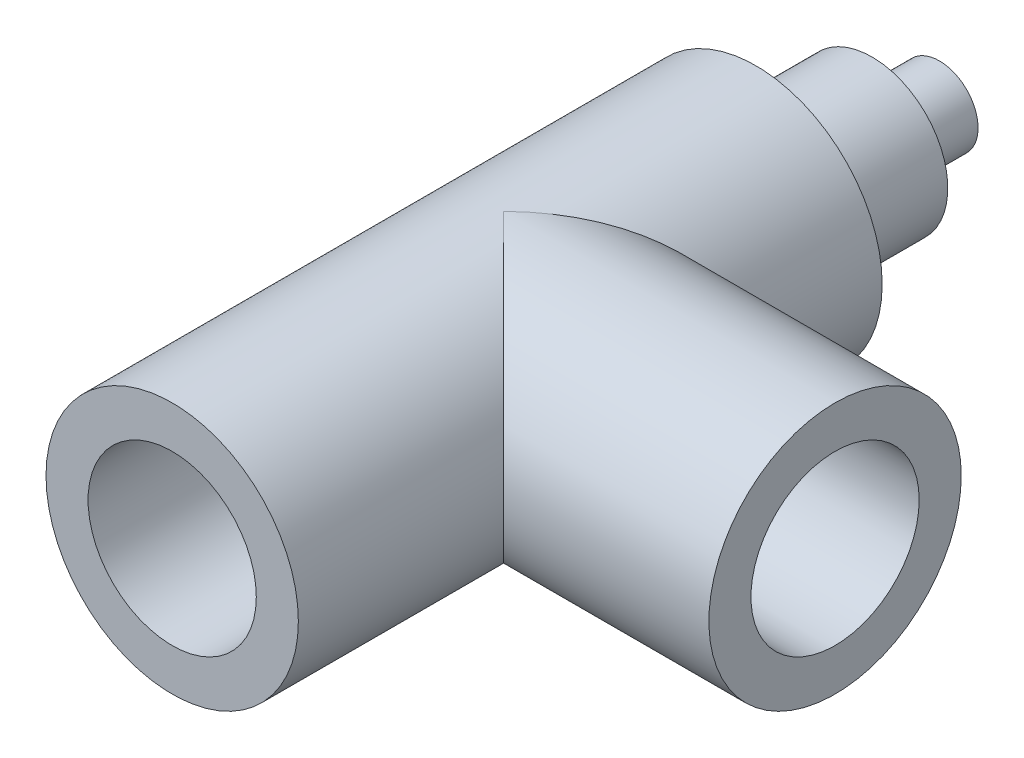
ISO-10303-21;
HEADER;
FILE_DESCRIPTION(('STEP AP214'),'2;1');
FILE_NAME('part.step','',(''),(''),'','','');
FILE_SCHEMA(('AUTOMOTIVE_DESIGN { 1 0 10303 214 1 1 1 1 }'));
ENDSEC;
DATA;
#1=APPLICATION_CONTEXT('core data for automotive mechanical design processes');
#2=APPLICATION_PROTOCOL_DEFINITION('international standard','automotive_design',2000,#1);
#3=PRODUCT_CONTEXT('',#1,'mechanical');
#4=PRODUCT('Part','Part','',(#3));
#5=PRODUCT_RELATED_PRODUCT_CATEGORY('part','',(#4));
#6=PRODUCT_DEFINITION_FORMATION('','',#4);
#7=PRODUCT_DEFINITION_CONTEXT('part definition',#1,'design');
#8=PRODUCT_DEFINITION('design','',#6,#7);
#9=PRODUCT_DEFINITION_SHAPE('','',#8);
#10=(LENGTH_UNIT() NAMED_UNIT(*) SI_UNIT(.MILLI.,.METRE.));
#11=(NAMED_UNIT(*) PLANE_ANGLE_UNIT() SI_UNIT($,.RADIAN.));
#12=(NAMED_UNIT(*) SI_UNIT($,.STERADIAN.) SOLID_ANGLE_UNIT());
#13=UNCERTAINTY_MEASURE_WITH_UNIT(LENGTH_MEASURE(1.E-05),#10,'distance_accuracy_value','');
#14=(GEOMETRIC_REPRESENTATION_CONTEXT(3) GLOBAL_UNCERTAINTY_ASSIGNED_CONTEXT((#13)) GLOBAL_UNIT_ASSIGNED_CONTEXT((#10,
#11,#12)) REPRESENTATION_CONTEXT('',''));
#15=CARTESIAN_POINT('',(0.,0.,0.));
#16=DIRECTION('',(0.,0.,1.));
#17=DIRECTION('',(1.,0.,0.));
#18=AXIS2_PLACEMENT_3D('',#15,#16,#17);
#19=CARTESIAN_POINT('',(0.,0.,-55.626));
#20=DIRECTION('',(0.,0.,-1.));
#21=DIRECTION('',(-1.,0.,0.));
#22=AXIS2_PLACEMENT_3D('',#19,#20,#21);
#23=PLANE('',#22);
#24=CARTESIAN_POINT('',(0.,0.,-55.626));
#25=DIRECTION('',(0.,0.,-1.));
#26=DIRECTION('',(-1.,0.,0.));
#27=AXIS2_PLACEMENT_3D('',#24,#25,#26);
#28=CIRCLE('',#27,11.43);
#29=CARTESIAN_POINT('',(-11.43,0.,-55.626));
#30=VERTEX_POINT('',#29);
#31=EDGE_CURVE('E176',#30,#30,#28,.T.);
#32=ORIENTED_EDGE('',*,*,#31,.T.);
#33=EDGE_LOOP('',(#32));
#34=FACE_BOUND('',#33,.T.);
#35=CARTESIAN_POINT('',(0.,0.,-55.626));
#36=DIRECTION('',(0.,0.,-1.));
#37=DIRECTION('',(-1.,0.,0.));
#38=AXIS2_PLACEMENT_3D('',#35,#36,#37);
#39=CIRCLE('',#38,5.842);
#40=CARTESIAN_POINT('',(-5.842,0.,-55.626));
#41=VERTEX_POINT('',#40);
#42=EDGE_CURVE('E161',#41,#41,#39,.T.);
#43=ORIENTED_EDGE('',*,*,#42,.F.);
#44=EDGE_LOOP('',(#43));
#45=FACE_BOUND('',#44,.T.);
#46=ADVANCED_FACE('F32',(#34,#45),#23,.T.);
#47=CARTESIAN_POINT('',(0.,0.,-38.1));
#48=DIRECTION('',(0.,0.,-1.));
#49=DIRECTION('',(-1.,0.,0.));
#50=AXIS2_PLACEMENT_3D('',#47,#48,#49);
#51=PLANE('',#50);
#52=CARTESIAN_POINT('',(0.,0.,-38.1));
#53=DIRECTION('',(0.,0.,-1.));
#54=DIRECTION('',(-1.,0.,0.));
#55=AXIS2_PLACEMENT_3D('',#52,#53,#54);
#56=CIRCLE('',#55,19.05);
#57=CARTESIAN_POINT('',(-19.05,0.,-38.1));
#58=VERTEX_POINT('',#57);
#59=EDGE_CURVE('E182',#58,#58,#56,.T.);
#60=ORIENTED_EDGE('',*,*,#59,.T.);
#61=EDGE_LOOP('',(#60));
#62=FACE_BOUND('',#61,.T.);
#63=CARTESIAN_POINT('',(0.,0.,-38.1));
#64=DIRECTION('',(0.,0.,-1.));
#65=DIRECTION('',(-1.,0.,0.));
#66=AXIS2_PLACEMENT_3D('',#63,#64,#65);
#67=CIRCLE('',#66,11.43);
#68=CARTESIAN_POINT('',(-11.43,0.,-38.1));
#69=VERTEX_POINT('',#68);
#70=EDGE_CURVE('E173',#69,#69,#67,.T.);
#71=ORIENTED_EDGE('',*,*,#70,.F.);
#72=EDGE_LOOP('',(#71));
#73=FACE_BOUND('',#72,.T.);
#74=ADVANCED_FACE('F288',(#62,#73),#51,.T.);
#75=CARTESIAN_POINT('',(0.,0.,-19.05));
#76=DIRECTION('',(0.,0.,1.));
#77=DIRECTION('',(1.,0.,0.));
#78=AXIS2_PLACEMENT_3D('',#75,#76,#77);
#79=CYLINDRICAL_SURFACE('',#78,12.7);
#80=CARTESIAN_POINT('',(0.,0.,50.038));
#81=DIRECTION('',(0.,0.,1.));
#82=DIRECTION('',(1.,0.,0.));
#83=AXIS2_PLACEMENT_3D('',#80,#81,#82);
#84=CIRCLE('',#83,12.7);
#85=CARTESIAN_POINT('',(12.7,0.,50.038));
#86=VERTEX_POINT('',#85);
#87=EDGE_CURVE('E191',#86,#86,#84,.T.);
#88=ORIENTED_EDGE('',*,*,#87,.T.);
#89=EDGE_LOOP('',(#88));
#90=FACE_BOUND('',#89,.T.);
#91=CARTESIAN_POINT('',(0.254000000000004,0.,0.));
#92=DIRECTION('',(-1.,0.,0.));
#93=DIRECTION('',(0.,-1.,0.));
#94=AXIS2_PLACEMENT_3D('',#91,#92,#93);
#95=CIRCLE('',#94,12.7);
#96=CARTESIAN_POINT('',(0.254000000000004,-12.6993649364873,0.));
#97=VERTEX_POINT('',#96);
#98=CARTESIAN_POINT('',(0.254000000000004,-12.6974597459492,0.254000000000006));
#99=VERTEX_POINT('',#98);
#100=EDGE_CURVE('E238',#97,#99,#95,.T.);
#101=ORIENTED_EDGE('',*,*,#100,.F.);
#102=CARTESIAN_POINT('',(0.,0.,0.));
#103=DIRECTION('',(0.,0.,1.));
#104=DIRECTION('',(1.,0.,0.));
#105=AXIS2_PLACEMENT_3D('',#102,#103,#104);
#106=CIRCLE('',#105,12.7);
#107=CARTESIAN_POINT('',(0.254000000000004,12.6993649364873,0.));
#108=VERTEX_POINT('',#107);
#109=EDGE_CURVE('E229',#108,#97,#106,.T.);
#110=ORIENTED_EDGE('',*,*,#109,.F.);
#111=CARTESIAN_POINT('',(0.254000000000004,0.,0.));
#112=DIRECTION('',(-1.,0.,0.));
#113=DIRECTION('',(0.,0.999799979995999,0.0200000000000005));
#114=AXIS2_PLACEMENT_3D('',#111,#112,#113);
#115=CIRCLE('',#114,12.7);
#116=CARTESIAN_POINT('',(0.254000000000004,12.6974597459492,0.254000000000006));
#117=VERTEX_POINT('',#116);
#118=EDGE_CURVE('E247',#117,#108,#115,.T.);
#119=ORIENTED_EDGE('',*,*,#118,.F.);
#120=CARTESIAN_POINT('',(0.,0.,0.));
#121=DIRECTION('',(-0.707106781186547,0.,0.707106781186547));
#122=DIRECTION('',(0.707106781186547,0.,0.707106781186547));
#123=AXIS2_PLACEMENT_3D('',#120,#121,#122);
#124=ELLIPSE('',#123,17.9605122421383,12.7);
#125=EDGE_CURVE('E244',#117,#99,#124,.F.);
#126=ORIENTED_EDGE('',*,*,#125,.T.);
#127=EDGE_LOOP('',(#101,#110,#119,#126));
#128=FACE_BOUND('',#127,.T.);
#129=ADVANCED_FACE('F213',(#90,#128),#79,.F.);
#130=CARTESIAN_POINT('',(50.038,0.,0.));
#131=DIRECTION('',(-1.,0.,0.));
#132=DIRECTION('',(0.,0.,1.));
#133=AXIS2_PLACEMENT_3D('',#130,#131,#132);
#134=CYLINDRICAL_SURFACE('',#133,19.05);
#135=CARTESIAN_POINT('',(50.038,0.,0.));
#136=DIRECTION('',(1.,0.,0.));
#137=DIRECTION('',(0.,0.,-1.));
#138=AXIS2_PLACEMENT_3D('',#135,#136,#137);
#139=CIRCLE('',#138,19.05);
#140=CARTESIAN_POINT('',(50.038,0.,-19.05));
#141=VERTEX_POINT('',#140);
#142=EDGE_CURVE('E230',#141,#141,#139,.T.);
#143=ORIENTED_EDGE('',*,*,#142,.F.);
#144=EDGE_LOOP('',(#143));
#145=FACE_BOUND('',#144,.T.);
#146=CARTESIAN_POINT('',(0.,0.,0.));
#147=DIRECTION('',(-0.707106781186548,0.,-0.707106781186547));
#148=DIRECTION('',(-0.707106781186548,0.,0.707106781186547));
#149=AXIS2_PLACEMENT_3D('',#146,#147,#148);
#150=ELLIPSE('',#149,26.9407683632075,19.05);
#151=CARTESIAN_POINT('',(0.,19.05,0.));
#152=VERTEX_POINT('',#151);
#153=CARTESIAN_POINT('',(0.,-19.05,0.));
#154=VERTEX_POINT('',#153);
#155=EDGE_CURVE('E185',#152,#154,#150,.T.);
#156=ORIENTED_EDGE('',*,*,#155,.F.);
#157=CARTESIAN_POINT('',(0.,0.,0.));
#158=DIRECTION('',(0.707106781186547,0.,-0.707106781186547));
#159=DIRECTION('',(-0.707106781186547,0.,-0.707106781186547));
#160=AXIS2_PLACEMENT_3D('',#157,#158,#159);
#161=ELLIPSE('',#160,26.9407683632075,19.05);
#162=EDGE_CURVE('E233',#152,#154,#161,.T.);
#163=ORIENTED_EDGE('',*,*,#162,.T.);
#164=EDGE_LOOP('',(#156,#163));
#165=FACE_BOUND('',#164,.T.);
#166=ADVANCED_FACE('F208',(#145,#165),#134,.T.);
#167=CARTESIAN_POINT('',(0.254000000000004,0.,0.));
#168=DIRECTION('',(1.,0.,0.));
#169=DIRECTION('',(0.,0.,-1.));
#170=AXIS2_PLACEMENT_3D('',#167,#168,#169);
#171=CYLINDRICAL_SURFACE('',#170,12.7);
#172=CARTESIAN_POINT('',(50.038,0.,0.));
#173=DIRECTION('',(1.,0.,0.));
#174=DIRECTION('',(0.,0.,-1.));
#175=AXIS2_PLACEMENT_3D('',#172,#173,#174);
#176=CIRCLE('',#175,12.7);
#177=CARTESIAN_POINT('',(50.038,0.,-12.7));
#178=VERTEX_POINT('',#177);
#179=EDGE_CURVE('E188',#178,#178,#176,.T.);
#180=ORIENTED_EDGE('',*,*,#179,.T.);
#181=EDGE_LOOP('',(#180));
#182=FACE_BOUND('',#181,.T.);
#183=DIRECTION('',(1.,0.,0.));
#184=VECTOR('',#183,1.);
#185=CARTESIAN_POINT('',(0.254000000000004,12.7,0.));
#186=LINE('',#185,#184);
#187=CARTESIAN_POINT('',(14.1990316571237,12.7,0.));
#188=VERTEX_POINT('',#187);
#189=EDGE_CURVE('E11',#188,#108,#186,.F.);
#190=ORIENTED_EDGE('',*,*,#189,.F.);
#191=CARTESIAN_POINT('',(14.1990316571237,-12.7,0.));
#192=CARTESIAN_POINT('',(14.1990243432653,-12.7000024971556,-0.156093266572542));
#193=CARTESIAN_POINT('',(14.201606918338,-12.6971214138173,-0.31216020868409));
#194=CARTESIAN_POINT('',(14.2118794412357,-12.6856245548947,-0.6238991319489));
#195=CARTESIAN_POINT('',(14.2195688784517,-12.6770093526354,-0.779571151026618));
#196=CARTESIAN_POINT('',(14.2501571767728,-12.6426469086637,-1.24503366753484));
#197=CARTESIAN_POINT('',(14.2805764862088,-12.6083826038732,-1.55376975804739));
#198=CARTESIAN_POINT('',(14.3596099397477,-12.518290929081,-2.16244940776499));
#199=CARTESIAN_POINT('',(14.4080415785084,-12.4626796759057,-2.46244966724968));
#200=CARTESIAN_POINT('',(14.5210191651402,-12.3308566689351,-3.05484636699331));
#201=CARTESIAN_POINT('',(14.5855697997495,-12.2546389230888,-3.34724056837474));
#202=CARTESIAN_POINT('',(14.7279316270802,-12.0831636655958,-3.92127836908744));
#203=CARTESIAN_POINT('',(14.8056715689297,-11.9880080053162,-4.20297026934815));
#204=CARTESIAN_POINT('',(14.972082302066,-11.7795197251442,-4.75608244719976));
#205=CARTESIAN_POINT('',(15.0607525372394,-11.666188029927,-5.02750324644802));
#206=CARTESIAN_POINT('',(15.3399737044406,-11.2996386846549,-5.8268559808617));
#207=CARTESIAN_POINT('',(15.5434085589588,-11.0202425000402,-6.33864041249572));
#208=CARTESIAN_POINT('',(15.876716418503,-10.5299449634905,-7.1078786639665));
#209=CARTESIAN_POINT('',(16.0013648364851,-10.3399615955413,-7.38144842274911));
#210=CARTESIAN_POINT('',(16.2530541823922,-9.93964524846194,-7.91226094555107));
#211=CARTESIAN_POINT('',(16.3800952687005,-9.72931091835389,-8.16950262376774));
#212=CARTESIAN_POINT('',(16.6337682589346,-9.28896489747604,-8.66692173021837));
#213=CARTESIAN_POINT('',(16.7604000039186,-9.05894633891537,-8.90709314873057));
#214=CARTESIAN_POINT('',(17.010613537037,-8.57989275039606,-9.36943156414286));
#215=CARTESIAN_POINT('',(17.1341951155552,-8.33085641826974,-9.59159732602529));
#216=CARTESIAN_POINT('',(17.3933377695029,-7.77694210083509,-10.0476790278662));
#217=CARTESIAN_POINT('',(17.5280374112121,-7.46920317322735,-10.2786273594757));
#218=CARTESIAN_POINT('',(17.786547874557,-6.83079913776941,-10.7135124529004));
#219=CARTESIAN_POINT('',(17.9103573763927,-6.50013125976983,-10.9174459422388));
#220=CARTESIAN_POINT('',(18.1434799149075,-5.8177750849115,-11.2958199913717));
#221=CARTESIAN_POINT('',(18.2528036870842,-5.46610263833013,-11.470282419079));
#222=CARTESIAN_POINT('',(18.4536988288141,-4.74382748353269,-11.787347016129));
#223=CARTESIAN_POINT('',(18.5452740025189,-4.37322885342981,-11.9299560137881));
#224=CARTESIAN_POINT('',(18.6985277332833,-3.65865182713615,-12.1667426687136));
#225=CARTESIAN_POINT('',(18.7624075239545,-3.31634998261398,-12.2645584401567));
#226=CARTESIAN_POINT('',(18.8719725718933,-2.62195236820408,-12.4315255651508));
#227=CARTESIAN_POINT('',(18.9176590569611,-2.26985726094436,-12.5006788530414));
#228=CARTESIAN_POINT('',(18.9894135710427,-1.55948274873719,-12.609003646454));
#229=CARTESIAN_POINT('',(19.015502274967,-1.20121027015352,-12.6482067490222));
#230=CARTESIAN_POINT('',(19.0473097392374,-0.481745935319567,-12.6959771681131));
#231=CARTESIAN_POINT('',(19.053031373673,-0.120554498187186,-12.7045488071809));
#232=CARTESIAN_POINT('',(19.0446325973002,0.545977117299571,-12.6919472067397));
#233=CARTESIAN_POINT('',(19.0334006929989,0.851447662486878,-12.6751042081578));
#234=CARTESIAN_POINT('',(18.996451065379,1.45947752977953,-12.6195518433243));
#235=CARTESIAN_POINT('',(18.9707352118784,1.76203722253707,-12.5808452995642));
#236=CARTESIAN_POINT('',(18.9053955177865,2.36212584065394,-12.4821010364081));
#237=CARTESIAN_POINT('',(18.8657710777771,2.65965454861369,-12.4220623976618));
#238=CARTESIAN_POINT('',(18.7734723737981,3.24774355834998,-12.281432245944));
#239=CARTESIAN_POINT('',(18.7207975458954,3.5383035583996,-12.2008398447993));
#240=CARTESIAN_POINT('',(18.6037334547357,4.10953188898308,-12.0204444837326));
#241=CARTESIAN_POINT('',(18.5393953016367,4.39023723780633,-11.9207252335232));
#242=CARTESIAN_POINT('',(18.4000604807808,4.94178325730278,-11.7028518347583));
#243=CARTESIAN_POINT('',(18.3250595346928,5.2126199132017,-11.5846902845573));
#244=CARTESIAN_POINT('',(18.165778900459,5.74314159926364,-11.3310529872876));
#245=CARTESIAN_POINT('',(18.0815009233468,6.00282867358842,-11.1955804322807));
#246=CARTESIAN_POINT('',(17.9050658018781,6.51024510289678,-10.9083329015306));
#247=CARTESIAN_POINT('',(17.8129077329909,6.7579730494282,-10.7565560123469));
#248=CARTESIAN_POINT('',(17.6096449511395,7.27249098316756,-10.4167177969197));
#249=CARTESIAN_POINT('',(17.4976417756893,7.53750908166859,-10.2265092208582));
#250=CARTESIAN_POINT('',(17.2676036675679,8.05055395621718,-9.82772451495387));
#251=CARTESIAN_POINT('',(17.1495682838252,8.29857945835083,-9.61914701068829));
#252=CARTESIAN_POINT('',(16.9095403385389,8.77734277512638,-9.18438670209434));
#253=CARTESIAN_POINT('',(16.7875424620975,9.00805587014066,-8.95817963006628));
#254=CARTESIAN_POINT('',(16.542086885425,9.45124551313284,-8.48928988397978));
#255=CARTESIAN_POINT('',(16.4186291037771,9.66372103851809,-8.24660628743628));
#256=CARTESIAN_POINT('',(16.1536272890879,10.1013861533791,-7.70654535577173));
#257=CARTESIAN_POINT('',(16.0122506737175,10.3234292928946,-7.40652576668948));
#258=CARTESIAN_POINT('',(15.7349583258097,10.7413451130242,-6.78626392513487));
#259=CARTESIAN_POINT('',(15.5990438755224,10.9372116734597,-6.46601696911488));
#260=CARTESIAN_POINT('',(15.3374386168,11.3011347365438,-5.80655199947935));
#261=CARTESIAN_POINT('',(15.2117374715267,11.4692195398227,-5.46735376844747));
#262=CARTESIAN_POINT('',(14.9755413827591,11.7759562037639,-4.77089826910036));
#263=CARTESIAN_POINT('',(14.8650387810908,11.9146229067357,-4.4136502206479));
#264=CARTESIAN_POINT('',(14.6927288221658,12.1259747283617,-3.78520870515959));
#265=CARTESIAN_POINT('',(14.6259488985521,12.2062643730825,-3.51791694068507));
#266=CARTESIAN_POINT('',(14.5051397309684,12.3495837139939,-2.97595130211546));
#267=CARTESIAN_POINT('',(14.451106823193,12.4126183705292,-2.70127957454793));
#268=CARTESIAN_POINT('',(14.3577951581124,12.5204353252326,-2.14669257331755));
#269=CARTESIAN_POINT('',(14.318476680619,12.56526678941,-1.86679358894581));
#270=CARTESIAN_POINT('',(14.2559401744115,12.6361756583378,-1.30295382405626));
#271=CARTESIAN_POINT('',(14.232712084845,12.6622647825084,-1.01901568267144));
#272=CARTESIAN_POINT('',(14.2116900493631,12.6858359044081,-0.612018807964135));
#273=CARTESIAN_POINT('',(14.2069467159929,12.6911462309692,-0.489703070018413));
#274=CARTESIAN_POINT('',(14.200617175157,12.6982278017591,-0.244930329655405));
#275=CARTESIAN_POINT('',(14.1990298699521,12.7000002765348,-0.122473391184785));
#276=CARTESIAN_POINT('',(14.1990316571237,12.7,0.));
#277=B_SPLINE_CURVE_WITH_KNOTS('',3,(#191,#192,#193,#194,#195,#196,#197,#198,#199,#200,#201,
#202,#203,#204,#205,#206,#207,#208,#209,#210,#211,#212,#213,#214,#215,#216,#217,#218,#219,#220,
#221,#222,#223,#224,#225,#226,#227,#228,#229,#230,#231,#232,#233,#234,#235,#236,#237,#238,#239,
#240,#241,#242,#243,#244,#245,#246,#247,#248,#249,#250,#251,#252,#253,#254,#255,#256,#257,#258,
#259,#260,#261,#262,#263,#264,#265,#266,#267,#268,#269,#270,#271,#272,#273,#274,#275,#276),
.UNSPECIFIED.,.F.,.F.,(4,2,2,2,2,2,2,2,2,2,2,2,2,2,2,2,2,2,2,2,2,2,2,2,2,2,2,2,2,2,2,2,2,2,2,2,
2,2,2,2,2,2,4),(0.,0.468180486109431,0.936314168289548,1.8710906779756,2.79664298417309,
3.72246471673835,4.64343559899405,5.56435964325145,7.41017281163777,8.47631623496532,
9.54253048175635,10.6091182573324,11.6757791289306,12.8971128940589,14.1185944719546,
15.3391656749505,16.5594749764105,17.6429101512111,18.7262721965139,19.8084897249474,
20.8905545307109,21.8078640316787,22.7250551389121,23.6422857791634,24.5595560616801,
25.472899865183,26.3866111778084,27.3001542491562,28.2138046492603,29.2474964082746,
30.2812655772728,31.3164837899865,32.351760010207,33.547745441447,34.744010011026,
35.9390483612628,37.1334823375122,37.9935928262201,38.8534557960235,39.7109806131073,
40.5679687596592,40.9354611344643,41.3028256646068),.UNSPECIFIED.);
#278=CARTESIAN_POINT('',(14.1990316571237,-12.7,0.));
#279=VERTEX_POINT('',#278);
#280=EDGE_CURVE('E41',#279,#188,#277,.T.);
#281=ORIENTED_EDGE('',*,*,#280,.F.);
#282=DIRECTION('',(1.,0.,0.));
#283=VECTOR('',#282,1.);
#284=CARTESIAN_POINT('',(0.254000000000004,-12.7,0.));
#285=LINE('',#284,#283);
#286=EDGE_CURVE('E262',#97,#279,#285,.T.);
#287=ORIENTED_EDGE('',*,*,#286,.F.);
#288=ORIENTED_EDGE('',*,*,#100,.T.);
#289=ORIENTED_EDGE('',*,*,#125,.F.);
#290=ORIENTED_EDGE('',*,*,#118,.T.);
#291=EDGE_LOOP('',(#190,#281,#287,#288,#289,#290));
#292=FACE_BOUND('',#291,.T.);
#293=ADVANCED_FACE('F198',(#182,#292),#171,.F.);
#294=CARTESIAN_POINT('',(0.,0.,50.038));
#295=DIRECTION('',(0.,0.,-1.));
#296=DIRECTION('',(-1.,0.,0.));
#297=AXIS2_PLACEMENT_3D('',#294,#295,#296);
#298=CYLINDRICAL_SURFACE('',#297,19.05);
#299=CARTESIAN_POINT('',(0.,0.,50.038));
#300=DIRECTION('',(0.,0.,1.));
#301=DIRECTION('',(1.,0.,0.));
#302=AXIS2_PLACEMENT_3D('',#299,#300,#301);
#303=CIRCLE('',#302,19.05);
#304=CARTESIAN_POINT('',(19.05,0.,50.038));
#305=VERTEX_POINT('',#304);
#306=EDGE_CURVE('E235',#305,#305,#303,.T.);
#307=ORIENTED_EDGE('',*,*,#306,.F.);
#308=EDGE_LOOP('',(#307));
#309=FACE_BOUND('',#308,.T.);
#310=ORIENTED_EDGE('',*,*,#162,.F.);
#311=ORIENTED_EDGE('',*,*,#155,.T.);
#312=EDGE_LOOP('',(#310,#311));
#313=FACE_BOUND('',#312,.T.);
#314=ORIENTED_EDGE('',*,*,#59,.F.);
#315=EDGE_LOOP('',(#314));
#316=FACE_BOUND('',#315,.T.);
#317=ADVANCED_FACE('F34',(#309,#313,#316),#298,.T.);
#318=CARTESIAN_POINT('',(0.,0.,50.038));
#319=DIRECTION('',(0.,0.,1.));
#320=DIRECTION('',(1.,0.,0.));
#321=AXIS2_PLACEMENT_3D('',#318,#319,#320);
#322=PLANE('',#321);
#323=ORIENTED_EDGE('',*,*,#87,.F.);
#324=EDGE_LOOP('',(#323));
#325=FACE_BOUND('',#324,.T.);
#326=ORIENTED_EDGE('',*,*,#306,.T.);
#327=EDGE_LOOP('',(#326));
#328=FACE_BOUND('',#327,.T.);
#329=ADVANCED_FACE('F416',(#325,#328),#322,.T.);
#330=CARTESIAN_POINT('',(50.038,0.,0.));
#331=DIRECTION('',(1.,0.,0.));
#332=DIRECTION('',(0.,0.,-1.));
#333=AXIS2_PLACEMENT_3D('',#330,#331,#332);
#334=PLANE('',#333);
#335=ORIENTED_EDGE('',*,*,#179,.F.);
#336=EDGE_LOOP('',(#335));
#337=FACE_BOUND('',#336,.T.);
#338=ORIENTED_EDGE('',*,*,#142,.T.);
#339=EDGE_LOOP('',(#338));
#340=FACE_BOUND('',#339,.T.);
#341=ADVANCED_FACE('F285',(#337,#340),#334,.T.);
#342=CARTESIAN_POINT('',(0.,0.,0.));
#343=DIRECTION('',(0.,0.,-1.));
#344=DIRECTION('',(-1.,0.,0.));
#345=AXIS2_PLACEMENT_3D('',#342,#343,#344);
#346=PLANE('',#345);
#347=ORIENTED_EDGE('',*,*,#189,.T.);
#348=ORIENTED_EDGE('',*,*,#109,.T.);
#349=ORIENTED_EDGE('',*,*,#286,.T.);
#350=CARTESIAN_POINT('',(0.,0.,0.));
#351=DIRECTION('',(0.,0.,-1.));
#352=DIRECTION('',(-1.,0.,0.));
#353=AXIS2_PLACEMENT_3D('',#350,#351,#352);
#354=CIRCLE('',#353,19.05);
#355=EDGE_CURVE('E179',#188,#279,#354,.T.);
#356=ORIENTED_EDGE('',*,*,#355,.F.);
#357=EDGE_LOOP('',(#347,#348,#349,#356));
#358=FACE_BOUND('',#357,.T.);
#359=ADVANCED_FACE('F273',(#358),#346,.F.);
#360=CARTESIAN_POINT('',(0.,0.,-38.1));
#361=DIRECTION('',(0.,0.,1.));
#362=DIRECTION('',(1.,0.,0.));
#363=AXIS2_PLACEMENT_3D('',#360,#361,#362);
#364=CYLINDRICAL_SURFACE('',#363,19.05);
#365=ORIENTED_EDGE('',*,*,#355,.T.);
#366=ORIENTED_EDGE('',*,*,#280,.T.);
#367=EDGE_LOOP('',(#365,#366));
#368=FACE_BOUND('',#367,.T.);
#369=ADVANCED_FACE('F210',(#368),#364,.T.);
#370=CARTESIAN_POINT('',(0.,0.,-55.626));
#371=DIRECTION('',(0.,0.,1.));
#372=DIRECTION('',(1.,0.,0.));
#373=AXIS2_PLACEMENT_3D('',#370,#371,#372);
#374=CYLINDRICAL_SURFACE('',#373,11.43);
#375=ORIENTED_EDGE('',*,*,#31,.F.);
#376=EDGE_LOOP('',(#375));
#377=FACE_BOUND('',#376,.T.);
#378=ORIENTED_EDGE('',*,*,#70,.T.);
#379=EDGE_LOOP('',(#378));
#380=FACE_BOUND('',#379,.T.);
#381=ADVANCED_FACE('F277',(#377,#380),#374,.T.);
#382=CARTESIAN_POINT('',(0.,0.,-65.786));
#383=DIRECTION('',(0.,0.,1.));
#384=DIRECTION('',(1.,0.,0.));
#385=AXIS2_PLACEMENT_3D('',#382,#383,#384);
#386=CYLINDRICAL_SURFACE('',#385,5.842);
#387=CARTESIAN_POINT('',(0.,0.,-65.786));
#388=DIRECTION('',(0.,0.,-1.));
#389=DIRECTION('',(-1.,0.,0.));
#390=AXIS2_PLACEMENT_3D('',#387,#388,#389);
#391=CIRCLE('',#390,5.842);
#392=CARTESIAN_POINT('',(-5.842,0.,-65.786));
#393=VERTEX_POINT('',#392);
#394=EDGE_CURVE('E170',#393,#393,#391,.T.);
#395=ORIENTED_EDGE('',*,*,#394,.F.);
#396=EDGE_LOOP('',(#395));
#397=FACE_BOUND('',#396,.T.);
#398=ORIENTED_EDGE('',*,*,#42,.T.);
#399=EDGE_LOOP('',(#398));
#400=FACE_BOUND('',#399,.T.);
#401=ADVANCED_FACE('F282',(#397,#400),#386,.T.);
#402=CARTESIAN_POINT('',(0.,0.,-65.786));
#403=DIRECTION('',(0.,0.,-1.));
#404=DIRECTION('',(-1.,0.,0.));
#405=AXIS2_PLACEMENT_3D('',#402,#403,#404);
#406=PLANE('',#405);
#407=DIRECTION('',(-0.499999999999995,0.866025403784442,0.));
#408=VECTOR('',#407,1.);
#409=CARTESIAN_POINT('',(-2.22788205628767,-3.85880491476116,-65.786));
#410=LINE('',#409,#408);
#411=CARTESIAN_POINT('',(-2.22788205628767,-3.85880491476116,-65.786));
#412=VERTEX_POINT('',#411);
#413=CARTESIAN_POINT('',(-4.45576411257524,0.,-65.786));
#414=VERTEX_POINT('',#413);
#415=EDGE_CURVE('E49',#412,#414,#410,.T.);
#416=ORIENTED_EDGE('',*,*,#415,.F.);
#417=DIRECTION('',(-1.,0.,0.));
#418=VECTOR('',#417,1.);
#419=CARTESIAN_POINT('',(2.22788205628758,-3.85880491476121,-65.786));
#420=LINE('',#419,#418);
#421=CARTESIAN_POINT('',(2.22788205628758,-3.85880491476121,-65.786));
#422=VERTEX_POINT('',#421);
#423=EDGE_CURVE('E141',#422,#412,#420,.T.);
#424=ORIENTED_EDGE('',*,*,#423,.F.);
#425=DIRECTION('',(-0.500000000000007,-0.866025403784435,0.));
#426=VECTOR('',#425,1.);
#427=CARTESIAN_POINT('',(4.45576411257524,0.,-65.786));
#428=LINE('',#427,#426);
#429=CARTESIAN_POINT('',(4.45576411257524,0.,-65.786));
#430=VERTEX_POINT('',#429);
#431=EDGE_CURVE('E135',#430,#422,#428,.T.);
#432=ORIENTED_EDGE('',*,*,#431,.F.);
#433=DIRECTION('',(0.499999999999995,-0.866025403784441,0.));
#434=VECTOR('',#433,1.);
#435=CARTESIAN_POINT('',(2.22788205628764,3.85880491476117,-65.786));
#436=LINE('',#435,#434);
#437=CARTESIAN_POINT('',(2.22788205628764,3.85880491476117,-65.786));
#438=VERTEX_POINT('',#437);
#439=EDGE_CURVE('E133',#438,#430,#436,.T.);
#440=ORIENTED_EDGE('',*,*,#439,.F.);
#441=DIRECTION('',(1.,0.,0.));
#442=VECTOR('',#441,1.);
#443=CARTESIAN_POINT('',(-2.22788205628761,3.85880491476119,-65.786));
#444=LINE('',#443,#442);
#445=CARTESIAN_POINT('',(-2.22788205628761,3.85880491476119,-65.786));
#446=VERTEX_POINT('',#445);
#447=EDGE_CURVE('E114',#446,#438,#444,.T.);
#448=ORIENTED_EDGE('',*,*,#447,.F.);
#449=DIRECTION('',(0.500000000000001,0.866025403784438,0.));
#450=VECTOR('',#449,1.);
#451=CARTESIAN_POINT('',(-4.45576411257524,0.,-65.786));
#452=LINE('',#451,#450);
#453=EDGE_CURVE('E125',#414,#446,#452,.T.);
#454=ORIENTED_EDGE('',*,*,#453,.F.);
#455=EDGE_LOOP('',(#416,#424,#432,#440,#448,#454));
#456=FACE_BOUND('',#455,.T.);
#457=ORIENTED_EDGE('',*,*,#394,.T.);
#458=EDGE_LOOP('',(#457));
#459=FACE_BOUND('',#458,.T.);
#460=ADVANCED_FACE('F129',(#456,#459),#406,.T.);
#461=CARTESIAN_POINT('',(-2.22788205628767,-3.85880491476116,-53.086));
#462=DIRECTION('',(-0.866025403784442,-0.499999999999995,0.));
#463=DIRECTION('',(0.499999999999995,-0.866025403784442,0.));
#464=AXIS2_PLACEMENT_3D('',#461,#462,#463);
#465=PLANE('',#464);
#466=ORIENTED_EDGE('',*,*,#415,.T.);
#467=DIRECTION('',(0.,0.,-1.));
#468=VECTOR('',#467,1.);
#469=CARTESIAN_POINT('',(-4.45576411257524,0.,-53.086));
#470=LINE('',#469,#468);
#471=CARTESIAN_POINT('',(-4.45576411257524,0.,-53.086));
#472=VERTEX_POINT('',#471);
#473=EDGE_CURVE('E122',#472,#414,#470,.T.);
#474=ORIENTED_EDGE('',*,*,#473,.F.);
#475=DIRECTION('',(-0.499999999999995,0.866025403784442,0.));
#476=VECTOR('',#475,1.);
#477=CARTESIAN_POINT('',(-2.22788205628767,-3.85880491476116,-53.086));
#478=LINE('',#477,#476);
#479=CARTESIAN_POINT('',(-2.22788205628767,-3.85880491476116,-53.086));
#480=VERTEX_POINT('',#479);
#481=EDGE_CURVE('E144',#480,#472,#478,.T.);
#482=ORIENTED_EDGE('',*,*,#481,.F.);
#483=DIRECTION('',(0.,0.,-1.));
#484=VECTOR('',#483,1.);
#485=CARTESIAN_POINT('',(-2.22788205628767,-3.85880491476116,-53.086));
#486=LINE('',#485,#484);
#487=EDGE_CURVE('E159',#480,#412,#486,.T.);
#488=ORIENTED_EDGE('',*,*,#487,.T.);
#489=EDGE_LOOP('',(#466,#474,#482,#488));
#490=FACE_BOUND('',#489,.T.);
#491=ADVANCED_FACE('F302',(#490),#465,.F.);
#492=CARTESIAN_POINT('',(2.22788205628758,-3.85880491476121,-53.086));
#493=DIRECTION('',(0.,-1.,0.));
#494=DIRECTION('',(1.,0.,0.));
#495=AXIS2_PLACEMENT_3D('',#492,#493,#494);
#496=PLANE('',#495);
#497=ORIENTED_EDGE('',*,*,#423,.T.);
#498=ORIENTED_EDGE('',*,*,#487,.F.);
#499=DIRECTION('',(-1.,0.,0.));
#500=VECTOR('',#499,1.);
#501=CARTESIAN_POINT('',(2.22788205628758,-3.85880491476121,-53.086));
#502=LINE('',#501,#500);
#503=CARTESIAN_POINT('',(2.22788205628758,-3.85880491476121,-53.086));
#504=VERTEX_POINT('',#503);
#505=EDGE_CURVE('E156',#504,#480,#502,.T.);
#506=ORIENTED_EDGE('',*,*,#505,.F.);
#507=DIRECTION('',(0.,0.,-1.));
#508=VECTOR('',#507,1.);
#509=CARTESIAN_POINT('',(2.22788205628758,-3.85880491476121,-53.086));
#510=LINE('',#509,#508);
#511=EDGE_CURVE('E162',#504,#422,#510,.T.);
#512=ORIENTED_EDGE('',*,*,#511,.T.);
#513=EDGE_LOOP('',(#497,#498,#506,#512));
#514=FACE_BOUND('',#513,.T.);
#515=ADVANCED_FACE('F305',(#514),#496,.F.);
#516=CARTESIAN_POINT('',(4.45576411257524,0.,-53.086));
#517=DIRECTION('',(0.866025403784434,-0.500000000000007,0.));
#518=DIRECTION('',(0.500000000000007,0.866025403784435,0.));
#519=AXIS2_PLACEMENT_3D('',#516,#517,#518);
#520=PLANE('',#519);
#521=ORIENTED_EDGE('',*,*,#431,.T.);
#522=ORIENTED_EDGE('',*,*,#511,.F.);
#523=DIRECTION('',(-0.500000000000007,-0.866025403784435,0.));
#524=VECTOR('',#523,1.);
#525=CARTESIAN_POINT('',(4.45576411257524,0.,-53.086));
#526=LINE('',#525,#524);
#527=CARTESIAN_POINT('',(4.45576411257524,0.,-53.086));
#528=VERTEX_POINT('',#527);
#529=EDGE_CURVE('E153',#528,#504,#526,.T.);
#530=ORIENTED_EDGE('',*,*,#529,.F.);
#531=DIRECTION('',(0.,0.,-1.));
#532=VECTOR('',#531,1.);
#533=CARTESIAN_POINT('',(4.45576411257524,0.,-53.086));
#534=LINE('',#533,#532);
#535=EDGE_CURVE('E164',#528,#430,#534,.T.);
#536=ORIENTED_EDGE('',*,*,#535,.T.);
#537=EDGE_LOOP('',(#521,#522,#530,#536));
#538=FACE_BOUND('',#537,.T.);
#539=ADVANCED_FACE('F314',(#538),#520,.F.);
#540=CARTESIAN_POINT('',(2.22788205628764,3.85880491476117,-53.086));
#541=DIRECTION('',(0.866025403784441,0.499999999999995,0.));
#542=DIRECTION('',(-0.499999999999995,0.866025403784442,0.));
#543=AXIS2_PLACEMENT_3D('',#540,#541,#542);
#544=PLANE('',#543);
#545=ORIENTED_EDGE('',*,*,#439,.T.);
#546=ORIENTED_EDGE('',*,*,#535,.F.);
#547=DIRECTION('',(0.499999999999995,-0.866025403784441,0.));
#548=VECTOR('',#547,1.);
#549=CARTESIAN_POINT('',(2.22788205628764,3.85880491476117,-53.086));
#550=LINE('',#549,#548);
#551=CARTESIAN_POINT('',(2.22788205628764,3.85880491476117,-53.086));
#552=VERTEX_POINT('',#551);
#553=EDGE_CURVE('E150',#552,#528,#550,.T.);
#554=ORIENTED_EDGE('',*,*,#553,.F.);
#555=DIRECTION('',(0.,0.,-1.));
#556=VECTOR('',#555,1.);
#557=CARTESIAN_POINT('',(2.22788205628764,3.85880491476117,-53.086));
#558=LINE('',#557,#556);
#559=EDGE_CURVE('E121',#552,#438,#558,.T.);
#560=ORIENTED_EDGE('',*,*,#559,.T.);
#561=EDGE_LOOP('',(#545,#546,#554,#560));
#562=FACE_BOUND('',#561,.T.);
#563=ADVANCED_FACE('F311',(#562),#544,.F.);
#564=CARTESIAN_POINT('',(-2.22788205628761,3.85880491476119,-53.086));
#565=DIRECTION('',(0.,1.,0.));
#566=DIRECTION('',(-1.,0.,0.));
#567=AXIS2_PLACEMENT_3D('',#564,#565,#566);
#568=PLANE('',#567);
#569=ORIENTED_EDGE('',*,*,#447,.T.);
#570=ORIENTED_EDGE('',*,*,#559,.F.);
#571=DIRECTION('',(1.,0.,0.));
#572=VECTOR('',#571,1.);
#573=CARTESIAN_POINT('',(-2.22788205628761,3.85880491476119,-53.086));
#574=LINE('',#573,#572);
#575=CARTESIAN_POINT('',(-2.22788205628761,3.85880491476119,-53.086));
#576=VERTEX_POINT('',#575);
#577=EDGE_CURVE('E117',#576,#552,#574,.T.);
#578=ORIENTED_EDGE('',*,*,#577,.F.);
#579=DIRECTION('',(0.,0.,-1.));
#580=VECTOR('',#579,1.);
#581=CARTESIAN_POINT('',(-2.22788205628761,3.85880491476119,-53.086));
#582=LINE('',#581,#580);
#583=EDGE_CURVE('E110',#576,#446,#582,.T.);
#584=ORIENTED_EDGE('',*,*,#583,.T.);
#585=EDGE_LOOP('',(#569,#570,#578,#584));
#586=FACE_BOUND('',#585,.T.);
#587=ADVANCED_FACE('F112',(#586),#568,.F.);
#588=CARTESIAN_POINT('',(-4.45576411257524,0.,-53.086));
#589=DIRECTION('',(-0.866025403784438,0.500000000000001,0.));
#590=DIRECTION('',(-0.500000000000001,-0.866025403784438,0.));
#591=AXIS2_PLACEMENT_3D('',#588,#589,#590);
#592=PLANE('',#591);
#593=ORIENTED_EDGE('',*,*,#453,.T.);
#594=ORIENTED_EDGE('',*,*,#583,.F.);
#595=DIRECTION('',(0.500000000000001,0.866025403784438,0.));
#596=VECTOR('',#595,1.);
#597=CARTESIAN_POINT('',(-4.45576411257524,0.,-53.086));
#598=LINE('',#597,#596);
#599=EDGE_CURVE('E147',#472,#576,#598,.T.);
#600=ORIENTED_EDGE('',*,*,#599,.F.);
#601=ORIENTED_EDGE('',*,*,#473,.T.);
#602=EDGE_LOOP('',(#593,#594,#600,#601));
#603=FACE_BOUND('',#602,.T.);
#604=ADVANCED_FACE('F126',(#603),#592,.F.);
#605=CARTESIAN_POINT('',(-6.68364616886285,3.85880491476121,-53.086));
#606=DIRECTION('',(0.,0.,-1.));
#607=DIRECTION('',(-1.,0.,0.));
#608=AXIS2_PLACEMENT_3D('',#605,#606,#607);
#609=PLANE('',#608);
#610=ORIENTED_EDGE('',*,*,#481,.T.);
#611=ORIENTED_EDGE('',*,*,#599,.T.);
#612=ORIENTED_EDGE('',*,*,#577,.T.);
#613=ORIENTED_EDGE('',*,*,#553,.T.);
#614=ORIENTED_EDGE('',*,*,#529,.T.);
#615=ORIENTED_EDGE('',*,*,#505,.T.);
#616=EDGE_LOOP('',(#610,#611,#612,#613,#614,#615));
#617=FACE_BOUND('',#616,.T.);
#618=ADVANCED_FACE('F308',(#617),#609,.T.);
#619=CLOSED_SHELL('',(#46,#74,#129,#166,#293,#317,#329,#341,#359,#369,#381,#401,#460,#491,#515,
#539,#563,#587,#604,#618));
#620=MANIFOLD_SOLID_BREP('B2',#619);
#621=ADVANCED_BREP_SHAPE_REPRESENTATION('',(#18,#620),#14);
#622=SHAPE_DEFINITION_REPRESENTATION(#9,#621);
ENDSEC;
END-ISO-10303-21;
